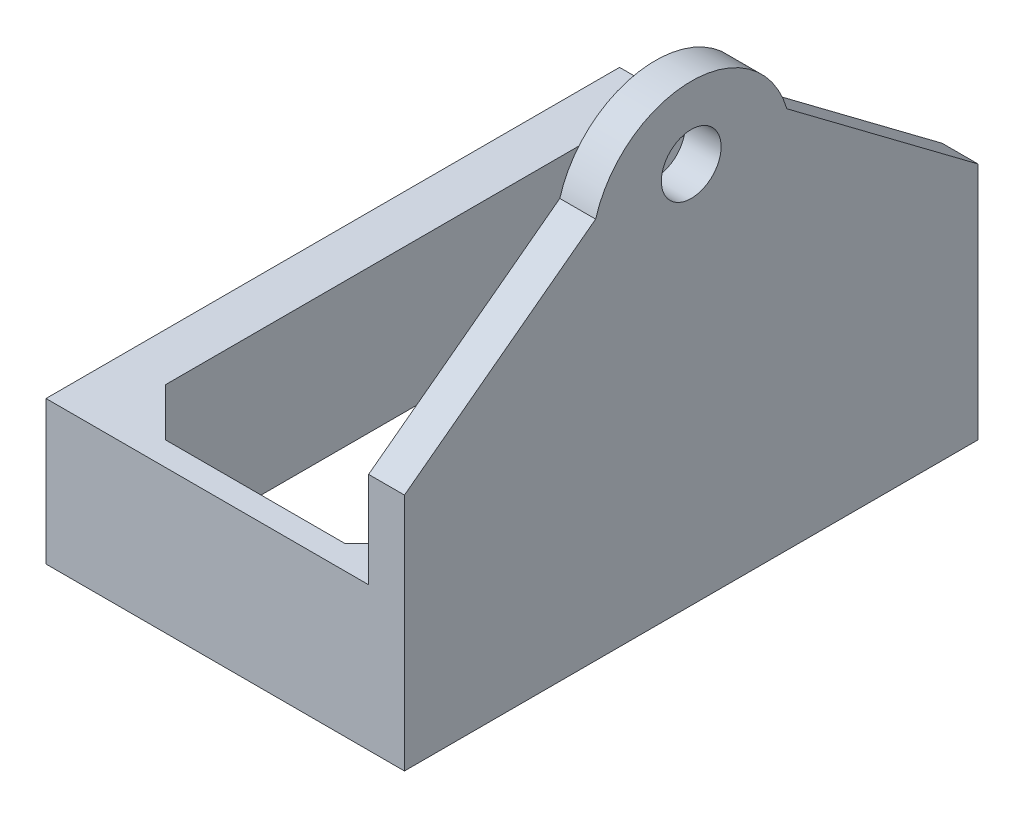
ISO-10303-21;
HEADER;
FILE_DESCRIPTION(('STEP AP214'),'2;1');
FILE_NAME('part.step','',(''),(''),'','','');
FILE_SCHEMA(('AUTOMOTIVE_DESIGN { 1 0 10303 214 1 1 1 1 }'));
ENDSEC;
DATA;
#1=APPLICATION_CONTEXT('core data for automotive mechanical design processes');
#2=APPLICATION_PROTOCOL_DEFINITION('international standard','automotive_design',2000,#1);
#3=PRODUCT_CONTEXT('',#1,'mechanical');
#4=PRODUCT('Part','Part','',(#3));
#5=PRODUCT_RELATED_PRODUCT_CATEGORY('part','',(#4));
#6=PRODUCT_DEFINITION_FORMATION('','',#4);
#7=PRODUCT_DEFINITION_CONTEXT('part definition',#1,'design');
#8=PRODUCT_DEFINITION('design','',#6,#7);
#9=PRODUCT_DEFINITION_SHAPE('','',#8);
#10=(LENGTH_UNIT() NAMED_UNIT(*) SI_UNIT(.MILLI.,.METRE.));
#11=(NAMED_UNIT(*) PLANE_ANGLE_UNIT() SI_UNIT($,.RADIAN.));
#12=(NAMED_UNIT(*) SI_UNIT($,.STERADIAN.) SOLID_ANGLE_UNIT());
#13=UNCERTAINTY_MEASURE_WITH_UNIT(LENGTH_MEASURE(1.E-05),#10,'distance_accuracy_value','');
#14=(GEOMETRIC_REPRESENTATION_CONTEXT(3) GLOBAL_UNCERTAINTY_ASSIGNED_CONTEXT((#13)) GLOBAL_UNIT_ASSIGNED_CONTEXT((#10,
#11,#12)) REPRESENTATION_CONTEXT('',''));
#15=CARTESIAN_POINT('',(0.,0.,0.));
#16=DIRECTION('',(0.,0.,1.));
#17=DIRECTION('',(1.,0.,0.));
#18=AXIS2_PLACEMENT_3D('',#15,#16,#17);
#19=CARTESIAN_POINT('',(-17.4625,6.35,0.));
#20=DIRECTION('',(1.,0.,0.));
#21=DIRECTION('',(0.,0.,-1.));
#22=AXIS2_PLACEMENT_3D('',#19,#20,#21);
#23=PLANE('',#22);
#24=DIRECTION('',(0.,0.,-1.));
#25=VECTOR('',#24,1.);
#26=CARTESIAN_POINT('',(-17.4625,19.05,-38.1));
#27=LINE('',#26,#25);
#28=CARTESIAN_POINT('',(-17.4625,19.05,28.575));
#29=VERTEX_POINT('',#28);
#30=CARTESIAN_POINT('',(-17.4625,19.05,-28.575));
#31=VERTEX_POINT('',#30);
#32=EDGE_CURVE('E162',#29,#31,#27,.T.);
#33=ORIENTED_EDGE('',*,*,#32,.F.);
#34=DIRECTION('',(0.,-1.,0.));
#35=VECTOR('',#34,1.);
#36=CARTESIAN_POINT('',(-17.4625,6.35,28.575));
#37=LINE('',#36,#35);
#38=CARTESIAN_POINT('',(-17.4625,0.,28.575));
#39=VERTEX_POINT('',#38);
#40=EDGE_CURVE('E224',#29,#39,#37,.T.);
#41=ORIENTED_EDGE('',*,*,#40,.T.);
#42=DIRECTION('',(0.,0.,1.));
#43=VECTOR('',#42,1.);
#44=CARTESIAN_POINT('',(-17.4625,0.,0.));
#45=LINE('',#44,#43);
#46=CARTESIAN_POINT('',(-17.4625,0.,-28.575));
#47=VERTEX_POINT('',#46);
#48=EDGE_CURVE('E183',#47,#39,#45,.T.);
#49=ORIENTED_EDGE('',*,*,#48,.F.);
#50=DIRECTION('',(0.,1.,0.));
#51=VECTOR('',#50,1.);
#52=CARTESIAN_POINT('',(-17.4625,19.05,-28.575));
#53=LINE('',#52,#51);
#54=EDGE_CURVE('E222',#47,#31,#53,.T.);
#55=ORIENTED_EDGE('',*,*,#54,.T.);
#56=EDGE_LOOP('',(#33,#41,#49,#55));
#57=FACE_BOUND('',#56,.T.);
#58=ADVANCED_FACE('F37',(#57),#23,.T.);
#59=CARTESIAN_POINT('',(19.05,60.325,0.));
#60=DIRECTION('',(1.,0.,0.));
#61=DIRECTION('',(0.,0.,-1.));
#62=AXIS2_PLACEMENT_3D('',#59,#60,#61);
#63=PLANE('',#62);
#64=CARTESIAN_POINT('',(19.05,50.8,0.));
#65=DIRECTION('',(1.,0.,0.));
#66=DIRECTION('',(0.,0.,-1.));
#67=AXIS2_PLACEMENT_3D('',#64,#65,#66);
#68=CIRCLE('',#67,3.96875);
#69=CARTESIAN_POINT('',(19.05,50.8,-3.96875));
#70=VERTEX_POINT('',#69);
#71=EDGE_CURVE('E312',#70,#70,#68,.F.);
#72=ORIENTED_EDGE('',*,*,#71,.F.);
#73=EDGE_LOOP('',(#72));
#74=FACE_BOUND('',#73,.T.);
#75=DIRECTION('',(0.,0.,-1.));
#76=VECTOR('',#75,1.);
#77=CARTESIAN_POINT('',(19.05,19.05,-38.1));
#78=LINE('',#77,#76);
#79=CARTESIAN_POINT('',(19.05,19.05,-28.5749999999999));
#80=VERTEX_POINT('',#79);
#81=CARTESIAN_POINT('',(19.05,19.05,-38.1));
#82=VERTEX_POINT('',#81);
#83=EDGE_CURVE('E165',#80,#82,#78,.T.);
#84=ORIENTED_EDGE('',*,*,#83,.F.);
#85=DIRECTION('',(0.,-1.,0.));
#86=VECTOR('',#85,1.);
#87=CARTESIAN_POINT('',(19.05,60.325,-28.5749999999999));
#88=LINE('',#87,#86);
#89=CARTESIAN_POINT('',(19.05,0.,-28.5749999999999));
#90=VERTEX_POINT('',#89);
#91=EDGE_CURVE('E210',#80,#90,#88,.T.);
#92=ORIENTED_EDGE('',*,*,#91,.T.);
#93=DIRECTION('',(0.,0.,1.));
#94=VECTOR('',#93,1.);
#95=CARTESIAN_POINT('',(19.05,0.,0.));
#96=LINE('',#95,#94);
#97=CARTESIAN_POINT('',(19.05,0.,28.575));
#98=VERTEX_POINT('',#97);
#99=EDGE_CURVE('E280',#90,#98,#96,.T.);
#100=ORIENTED_EDGE('',*,*,#99,.T.);
#101=DIRECTION('',(0.,1.,0.));
#102=VECTOR('',#101,1.);
#103=CARTESIAN_POINT('',(19.05,19.05,28.575));
#104=LINE('',#103,#102);
#105=CARTESIAN_POINT('',(19.05,19.05,28.575));
#106=VERTEX_POINT('',#105);
#107=EDGE_CURVE('E207',#98,#106,#104,.T.);
#108=ORIENTED_EDGE('',*,*,#107,.T.);
#109=DIRECTION('',(0.,0.,-1.));
#110=VECTOR('',#109,1.);
#111=CARTESIAN_POINT('',(19.05,19.05,38.1));
#112=LINE('',#111,#110);
#113=CARTESIAN_POINT('',(19.05,19.05,38.1));
#114=VERTEX_POINT('',#113);
#115=EDGE_CURVE('E173',#114,#106,#112,.T.);
#116=ORIENTED_EDGE('',*,*,#115,.F.);
#117=DIRECTION('',(0.,-1.,0.));
#118=VECTOR('',#117,1.);
#119=CARTESIAN_POINT('',(19.05,60.325,38.1));
#120=LINE('',#119,#118);
#121=CARTESIAN_POINT('',(19.05,31.75,38.1));
#122=VERTEX_POINT('',#121);
#123=EDGE_CURVE('E181',#122,#114,#120,.T.);
#124=ORIENTED_EDGE('',*,*,#123,.F.);
#125=DIRECTION('',(0.,-0.6,0.8));
#126=VECTOR('',#125,1.);
#127=CARTESIAN_POINT('',(19.05,38.608,28.956));
#128=LINE('',#127,#126);
#129=CARTESIAN_POINT('',(19.05,50.8,12.7));
#130=VERTEX_POINT('',#129);
#131=EDGE_CURVE('E304',#130,#122,#128,.T.);
#132=ORIENTED_EDGE('',*,*,#131,.F.);
#133=CARTESIAN_POINT('',(19.05,47.0958333333333,0.));
#134=DIRECTION('',(1.,0.,0.));
#135=DIRECTION('',(0.,0.,-1.));
#136=AXIS2_PLACEMENT_3D('',#133,#134,#135);
#137=CIRCLE('',#136,13.2291666666667);
#138=CARTESIAN_POINT('',(19.05,50.8,-12.7));
#139=VERTEX_POINT('',#138);
#140=EDGE_CURVE('E292',#139,#130,#137,.T.);
#141=ORIENTED_EDGE('',*,*,#140,.F.);
#142=DIRECTION('',(0.,0.6,0.8));
#143=VECTOR('',#142,1.);
#144=CARTESIAN_POINT('',(19.05,38.608,-28.956));
#145=LINE('',#144,#143);
#146=CARTESIAN_POINT('',(19.05,31.75,-38.1));
#147=VERTEX_POINT('',#146);
#148=EDGE_CURVE('E179',#147,#139,#145,.T.);
#149=ORIENTED_EDGE('',*,*,#148,.F.);
#150=DIRECTION('',(0.,-1.,0.));
#151=VECTOR('',#150,1.);
#152=CARTESIAN_POINT('',(19.05,60.325,-38.1));
#153=LINE('',#152,#151);
#154=EDGE_CURVE('E155',#147,#82,#153,.T.);
#155=ORIENTED_EDGE('',*,*,#154,.T.);
#156=EDGE_LOOP('',(#84,#92,#100,#108,#116,#124,#132,#141,#149,#155));
#157=FACE_BOUND('',#156,.T.);
#158=ADVANCED_FACE('F177',(#74,#157),#63,.F.);
#159=CARTESIAN_POINT('',(0.,6.35,-34.925));
#160=DIRECTION('',(0.,0.,1.));
#161=DIRECTION('',(1.,0.,0.));
#162=AXIS2_PLACEMENT_3D('',#159,#160,#161);
#163=PLANE('',#162);
#164=DIRECTION('',(-1.,0.,0.));
#165=VECTOR('',#164,1.);
#166=CARTESIAN_POINT('',(0.,0.,-34.925));
#167=LINE('',#166,#165);
#168=CARTESIAN_POINT('',(12.7,0.,-34.925));
#169=VERTEX_POINT('',#168);
#170=CARTESIAN_POINT('',(-11.1124999999999,0.,-34.925));
#171=VERTEX_POINT('',#170);
#172=EDGE_CURVE('E191',#169,#171,#167,.T.);
#173=ORIENTED_EDGE('',*,*,#172,.F.);
#174=DIRECTION('',(0.,1.,0.));
#175=VECTOR('',#174,1.);
#176=CARTESIAN_POINT('',(12.7,6.35,-34.925));
#177=LINE('',#176,#175);
#178=CARTESIAN_POINT('',(12.7,19.05,-34.925));
#179=VERTEX_POINT('',#178);
#180=EDGE_CURVE('E215',#169,#179,#177,.T.);
#181=ORIENTED_EDGE('',*,*,#180,.T.);
#182=DIRECTION('',(1.,0.,0.));
#183=VECTOR('',#182,1.);
#184=CARTESIAN_POINT('',(-17.4625,19.05,-34.925));
#185=LINE('',#184,#183);
#186=CARTESIAN_POINT('',(-11.1124999999999,19.05,-34.925));
#187=VERTEX_POINT('',#186);
#188=EDGE_CURVE('E174',#187,#179,#185,.T.);
#189=ORIENTED_EDGE('',*,*,#188,.F.);
#190=DIRECTION('',(0.,-1.,0.));
#191=VECTOR('',#190,1.);
#192=CARTESIAN_POINT('',(-11.1124999999999,0.,-34.925));
#193=LINE('',#192,#191);
#194=EDGE_CURVE('E212',#187,#171,#193,.T.);
#195=ORIENTED_EDGE('',*,*,#194,.T.);
#196=EDGE_LOOP('',(#173,#181,#189,#195));
#197=FACE_BOUND('',#196,.T.);
#198=ADVANCED_FACE('F262',(#197),#163,.T.);
#199=CARTESIAN_POINT('',(0.,6.35,-38.1));
#200=DIRECTION('',(0.,0.,1.));
#201=DIRECTION('',(1.,0.,0.));
#202=AXIS2_PLACEMENT_3D('',#199,#200,#201);
#203=PLANE('',#202);
#204=ORIENTED_EDGE('',*,*,#154,.F.);
#205=DIRECTION('',(1.,0.,0.));
#206=VECTOR('',#205,1.);
#207=CARTESIAN_POINT('',(-23.8135,31.75,-38.1));
#208=LINE('',#207,#206);
#209=CARTESIAN_POINT('',(23.8125,31.75,-38.1));
#210=VERTEX_POINT('',#209);
#211=EDGE_CURVE('E310',#147,#210,#208,.T.);
#212=ORIENTED_EDGE('',*,*,#211,.T.);
#213=DIRECTION('',(0.,-1.,0.));
#214=VECTOR('',#213,1.);
#215=CARTESIAN_POINT('',(23.8125,60.325,-38.1));
#216=LINE('',#215,#214);
#217=CARTESIAN_POINT('',(23.8125,0.,-38.1));
#218=VERTEX_POINT('',#217);
#219=EDGE_CURVE('E180',#210,#218,#216,.T.);
#220=ORIENTED_EDGE('',*,*,#219,.T.);
#221=DIRECTION('',(-1.,0.,0.));
#222=VECTOR('',#221,1.);
#223=CARTESIAN_POINT('',(0.,0.,-38.1));
#224=LINE('',#223,#222);
#225=CARTESIAN_POINT('',(-23.8125,0.,-38.1));
#226=VERTEX_POINT('',#225);
#227=EDGE_CURVE('E193',#218,#226,#224,.T.);
#228=ORIENTED_EDGE('',*,*,#227,.T.);
#229=DIRECTION('',(0.,-1.,0.));
#230=VECTOR('',#229,1.);
#231=CARTESIAN_POINT('',(-23.8125,6.35,-38.1));
#232=LINE('',#231,#230);
#233=CARTESIAN_POINT('',(-23.8125,19.05,-38.1));
#234=VERTEX_POINT('',#233);
#235=EDGE_CURVE('E157',#234,#226,#232,.T.);
#236=ORIENTED_EDGE('',*,*,#235,.F.);
#237=DIRECTION('',(-1.,0.,0.));
#238=VECTOR('',#237,1.);
#239=CARTESIAN_POINT('',(-23.8125,19.05,-38.1));
#240=LINE('',#239,#238);
#241=EDGE_CURVE('E150',#82,#234,#240,.T.);
#242=ORIENTED_EDGE('',*,*,#241,.F.);
#243=EDGE_LOOP('',(#204,#212,#220,#228,#236,#242));
#244=FACE_BOUND('',#243,.T.);
#245=ADVANCED_FACE('F152',(#244),#203,.F.);
#246=CARTESIAN_POINT('',(-23.8125,6.35,0.));
#247=DIRECTION('',(-1.,0.,0.));
#248=DIRECTION('',(0.,0.,1.));
#249=AXIS2_PLACEMENT_3D('',#246,#247,#248);
#250=PLANE('',#249);
#251=DIRECTION('',(0.,0.,-1.));
#252=VECTOR('',#251,1.);
#253=CARTESIAN_POINT('',(-23.8125,0.,0.));
#254=LINE('',#253,#252);
#255=CARTESIAN_POINT('',(-23.8125,0.,38.1));
#256=VERTEX_POINT('',#255);
#257=EDGE_CURVE('E195',#256,#226,#254,.T.);
#258=ORIENTED_EDGE('',*,*,#257,.F.);
#259=DIRECTION('',(0.,-1.,0.));
#260=VECTOR('',#259,1.);
#261=CARTESIAN_POINT('',(-23.8125,6.35,38.1));
#262=LINE('',#261,#260);
#263=CARTESIAN_POINT('',(-23.8125,19.05,38.1));
#264=VERTEX_POINT('',#263);
#265=EDGE_CURVE('E204',#264,#256,#262,.T.);
#266=ORIENTED_EDGE('',*,*,#265,.F.);
#267=DIRECTION('',(0.,0.,1.));
#268=VECTOR('',#267,1.);
#269=CARTESIAN_POINT('',(-23.8125,19.05,-38.1));
#270=LINE('',#269,#268);
#271=EDGE_CURVE('E290',#234,#264,#270,.T.);
#272=ORIENTED_EDGE('',*,*,#271,.F.);
#273=ORIENTED_EDGE('',*,*,#235,.T.);
#274=EDGE_LOOP('',(#258,#266,#272,#273));
#275=FACE_BOUND('',#274,.T.);
#276=ADVANCED_FACE('F329',(#275),#250,.T.);
#277=CARTESIAN_POINT('',(0.,6.35,38.1));
#278=DIRECTION('',(0.,0.,1.));
#279=DIRECTION('',(1.,0.,0.));
#280=AXIS2_PLACEMENT_3D('',#277,#278,#279);
#281=PLANE('',#280);
#282=ORIENTED_EDGE('',*,*,#123,.T.);
#283=DIRECTION('',(1.,0.,0.));
#284=VECTOR('',#283,1.);
#285=CARTESIAN_POINT('',(-23.8125,19.05,38.1));
#286=LINE('',#285,#284);
#287=EDGE_CURVE('E244',#264,#114,#286,.T.);
#288=ORIENTED_EDGE('',*,*,#287,.F.);
#289=ORIENTED_EDGE('',*,*,#265,.T.);
#290=DIRECTION('',(-1.,0.,0.));
#291=VECTOR('',#290,1.);
#292=CARTESIAN_POINT('',(0.,0.,38.1));
#293=LINE('',#292,#291);
#294=CARTESIAN_POINT('',(23.8125,0.,38.1));
#295=VERTEX_POINT('',#294);
#296=EDGE_CURVE('E198',#295,#256,#293,.T.);
#297=ORIENTED_EDGE('',*,*,#296,.F.);
#298=DIRECTION('',(0.,-1.,0.));
#299=VECTOR('',#298,1.);
#300=CARTESIAN_POINT('',(23.8125,60.325,38.1));
#301=LINE('',#300,#299);
#302=CARTESIAN_POINT('',(23.8125,31.75,38.1));
#303=VERTEX_POINT('',#302);
#304=EDGE_CURVE('E186',#303,#295,#301,.T.);
#305=ORIENTED_EDGE('',*,*,#304,.F.);
#306=DIRECTION('',(1.,0.,0.));
#307=VECTOR('',#306,1.);
#308=CARTESIAN_POINT('',(-23.8135,31.75,38.1));
#309=LINE('',#308,#307);
#310=EDGE_CURVE('E295',#122,#303,#309,.T.);
#311=ORIENTED_EDGE('',*,*,#310,.F.);
#312=EDGE_LOOP('',(#282,#288,#289,#297,#305,#311));
#313=FACE_BOUND('',#312,.T.);
#314=ADVANCED_FACE('F333',(#313),#281,.T.);
#315=CARTESIAN_POINT('',(0.,6.35,34.925));
#316=DIRECTION('',(0.,0.,1.));
#317=DIRECTION('',(1.,0.,0.));
#318=AXIS2_PLACEMENT_3D('',#315,#316,#317);
#319=PLANE('',#318);
#320=DIRECTION('',(-1.,0.,0.));
#321=VECTOR('',#320,1.);
#322=CARTESIAN_POINT('',(-17.4625,19.05,34.925));
#323=LINE('',#322,#321);
#324=CARTESIAN_POINT('',(12.7,19.05,34.925));
#325=VERTEX_POINT('',#324);
#326=CARTESIAN_POINT('',(-11.1125,19.05,34.925));
#327=VERTEX_POINT('',#326);
#328=EDGE_CURVE('E241',#325,#327,#323,.T.);
#329=ORIENTED_EDGE('',*,*,#328,.F.);
#330=DIRECTION('',(0.,-1.,0.));
#331=VECTOR('',#330,1.);
#332=CARTESIAN_POINT('',(12.7,0.,34.925));
#333=LINE('',#332,#331);
#334=CARTESIAN_POINT('',(12.7,0.,34.925));
#335=VERTEX_POINT('',#334);
#336=EDGE_CURVE('E219',#325,#335,#333,.T.);
#337=ORIENTED_EDGE('',*,*,#336,.T.);
#338=DIRECTION('',(-1.,0.,0.));
#339=VECTOR('',#338,1.);
#340=CARTESIAN_POINT('',(0.,0.,34.925));
#341=LINE('',#340,#339);
#342=CARTESIAN_POINT('',(-11.1125,0.,34.925));
#343=VERTEX_POINT('',#342);
#344=EDGE_CURVE('E201',#335,#343,#341,.T.);
#345=ORIENTED_EDGE('',*,*,#344,.T.);
#346=DIRECTION('',(0.,1.,0.));
#347=VECTOR('',#346,1.);
#348=CARTESIAN_POINT('',(-11.1125,6.35,34.925));
#349=LINE('',#348,#347);
#350=EDGE_CURVE('E217',#343,#327,#349,.T.);
#351=ORIENTED_EDGE('',*,*,#350,.T.);
#352=EDGE_LOOP('',(#329,#337,#345,#351));
#353=FACE_BOUND('',#352,.T.);
#354=ADVANCED_FACE('F339',(#353),#319,.F.);
#355=CARTESIAN_POINT('',(0.,0.,0.));
#356=DIRECTION('',(0.,1.,0.));
#357=DIRECTION('',(0.,0.,1.));
#358=AXIS2_PLACEMENT_3D('',#355,#356,#357);
#359=PLANE('',#358);
#360=DIRECTION('',(0.,0.,-1.));
#361=VECTOR('',#360,1.);
#362=CARTESIAN_POINT('',(23.8125,0.,0.));
#363=LINE('',#362,#361);
#364=EDGE_CURVE('E161',#295,#218,#363,.T.);
#365=ORIENTED_EDGE('',*,*,#364,.F.);
#366=ORIENTED_EDGE('',*,*,#296,.T.);
#367=ORIENTED_EDGE('',*,*,#257,.T.);
#368=ORIENTED_EDGE('',*,*,#227,.F.);
#369=EDGE_LOOP('',(#365,#366,#367,#368));
#370=FACE_BOUND('',#369,.T.);
#371=ORIENTED_EDGE('',*,*,#172,.T.);
#372=DIRECTION('',(0.707106781186551,0.,-0.707106781186544));
#373=VECTOR('',#372,1.);
#374=CARTESIAN_POINT('',(-23.0187499999999,0.,-23.0187500000002));
#375=LINE('',#374,#373);
#376=EDGE_CURVE('E45',#171,#47,#375,.F.);
#377=ORIENTED_EDGE('',*,*,#376,.T.);
#378=ORIENTED_EDGE('',*,*,#48,.T.);
#379=DIRECTION('',(0.707106781186544,0.,0.707106781186551));
#380=VECTOR('',#379,1.);
#381=CARTESIAN_POINT('',(-23.0187500000001,0.,23.0187499999999));
#382=LINE('',#381,#380);
#383=EDGE_CURVE('E52',#39,#343,#382,.T.);
#384=ORIENTED_EDGE('',*,*,#383,.T.);
#385=ORIENTED_EDGE('',*,*,#344,.F.);
#386=DIRECTION('',(-0.707106781186551,0.,0.707106781186545));
#387=VECTOR('',#386,1.);
#388=CARTESIAN_POINT('',(23.8124999999999,0.,23.8125000000001));
#389=LINE('',#388,#387);
#390=EDGE_CURVE('E229',#335,#98,#389,.F.);
#391=ORIENTED_EDGE('',*,*,#390,.T.);
#392=ORIENTED_EDGE('',*,*,#99,.F.);
#393=DIRECTION('',(-0.707106781186544,0.,-0.707106781186551));
#394=VECTOR('',#393,1.);
#395=CARTESIAN_POINT('',(23.8125000000001,0.,-23.8124999999998));
#396=LINE('',#395,#394);
#397=EDGE_CURVE('E226',#90,#169,#396,.T.);
#398=ORIENTED_EDGE('',*,*,#397,.T.);
#399=EDGE_LOOP('',(#371,#377,#378,#384,#385,#391,#392,#398));
#400=FACE_BOUND('',#399,.T.);
#401=ADVANCED_FACE('F282',(#370,#400),#359,.F.);
#402=CARTESIAN_POINT('',(23.8125,60.325,0.));
#403=DIRECTION('',(-1.,0.,0.));
#404=DIRECTION('',(0.,0.,1.));
#405=AXIS2_PLACEMENT_3D('',#402,#403,#404);
#406=PLANE('',#405);
#407=CARTESIAN_POINT('',(23.8125,50.8,0.));
#408=DIRECTION('',(1.,0.,0.));
#409=DIRECTION('',(0.,0.,-1.));
#410=AXIS2_PLACEMENT_3D('',#407,#408,#409);
#411=CIRCLE('',#410,3.96875);
#412=CARTESIAN_POINT('',(23.8125,50.8,-3.96875));
#413=VERTEX_POINT('',#412);
#414=EDGE_CURVE('E317',#413,#413,#411,.T.);
#415=ORIENTED_EDGE('',*,*,#414,.F.);
#416=EDGE_LOOP('',(#415));
#417=FACE_BOUND('',#416,.T.);
#418=ORIENTED_EDGE('',*,*,#219,.F.);
#419=DIRECTION('',(0.,-0.6,-0.8));
#420=VECTOR('',#419,1.);
#421=CARTESIAN_POINT('',(23.8125,38.608,-28.956));
#422=LINE('',#421,#420);
#423=CARTESIAN_POINT('',(23.8125,50.8,-12.7));
#424=VERTEX_POINT('',#423);
#425=EDGE_CURVE('E307',#424,#210,#422,.T.);
#426=ORIENTED_EDGE('',*,*,#425,.F.);
#427=CARTESIAN_POINT('',(23.8125,47.0958333333333,0.));
#428=DIRECTION('',(1.,0.,0.));
#429=DIRECTION('',(0.,0.,-1.));
#430=AXIS2_PLACEMENT_3D('',#427,#428,#429);
#431=CIRCLE('',#430,13.2291666666667);
#432=CARTESIAN_POINT('',(23.8125,50.8,12.7));
#433=VERTEX_POINT('',#432);
#434=EDGE_CURVE('E298',#433,#424,#431,.F.);
#435=ORIENTED_EDGE('',*,*,#434,.F.);
#436=DIRECTION('',(0.,0.6,-0.8));
#437=VECTOR('',#436,1.);
#438=CARTESIAN_POINT('',(23.8125,38.608,28.956));
#439=LINE('',#438,#437);
#440=EDGE_CURVE('E301',#303,#433,#439,.T.);
#441=ORIENTED_EDGE('',*,*,#440,.F.);
#442=ORIENTED_EDGE('',*,*,#304,.T.);
#443=ORIENTED_EDGE('',*,*,#364,.T.);
#444=EDGE_LOOP('',(#418,#426,#435,#441,#442,#443));
#445=FACE_BOUND('',#444,.T.);
#446=ADVANCED_FACE('F346',(#417,#445),#406,.F.);
#447=CARTESIAN_POINT('',(0.,19.05,0.));
#448=DIRECTION('',(0.,1.,0.));
#449=DIRECTION('',(0.,0.,1.));
#450=AXIS2_PLACEMENT_3D('',#447,#448,#449);
#451=PLANE('',#450);
#452=ORIENTED_EDGE('',*,*,#271,.T.);
#453=ORIENTED_EDGE('',*,*,#287,.T.);
#454=ORIENTED_EDGE('',*,*,#115,.T.);
#455=DIRECTION('',(0.707106781186551,0.,-0.707106781186545));
#456=VECTOR('',#455,1.);
#457=CARTESIAN_POINT('',(12.7,19.05,34.925));
#458=LINE('',#457,#456);
#459=EDGE_CURVE('E231',#106,#325,#458,.F.);
#460=ORIENTED_EDGE('',*,*,#459,.T.);
#461=ORIENTED_EDGE('',*,*,#328,.T.);
#462=DIRECTION('',(-0.707106781186544,0.,-0.707106781186551));
#463=VECTOR('',#462,1.);
#464=CARTESIAN_POINT('',(-17.4625,19.05,28.575));
#465=LINE('',#464,#463);
#466=EDGE_CURVE('E234',#327,#29,#465,.T.);
#467=ORIENTED_EDGE('',*,*,#466,.T.);
#468=ORIENTED_EDGE('',*,*,#32,.T.);
#469=DIRECTION('',(-0.707106781186551,0.,0.707106781186544));
#470=VECTOR('',#469,1.);
#471=CARTESIAN_POINT('',(-11.1124999999999,19.05,-34.925));
#472=LINE('',#471,#470);
#473=EDGE_CURVE('E12',#31,#187,#472,.F.);
#474=ORIENTED_EDGE('',*,*,#473,.T.);
#475=ORIENTED_EDGE('',*,*,#188,.T.);
#476=DIRECTION('',(0.707106781186544,0.,0.707106781186551));
#477=VECTOR('',#476,1.);
#478=CARTESIAN_POINT('',(19.05,19.05,-28.5749999999999));
#479=LINE('',#478,#477);
#480=EDGE_CURVE('E169',#179,#80,#479,.T.);
#481=ORIENTED_EDGE('',*,*,#480,.T.);
#482=ORIENTED_EDGE('',*,*,#83,.T.);
#483=ORIENTED_EDGE('',*,*,#241,.T.);
#484=EDGE_LOOP('',(#452,#453,#454,#460,#461,#467,#468,#474,#475,#481,#482,#483));
#485=FACE_BOUND('',#484,.T.);
#486=ADVANCED_FACE('F166',(#485),#451,.T.);
#487=CARTESIAN_POINT('',(-23.8135,38.608,28.956));
#488=DIRECTION('',(0.,-0.8,-0.6));
#489=DIRECTION('',(0.,0.6,-0.8));
#490=AXIS2_PLACEMENT_3D('',#487,#488,#489);
#491=PLANE('',#490);
#492=ORIENTED_EDGE('',*,*,#131,.T.);
#493=ORIENTED_EDGE('',*,*,#310,.T.);
#494=ORIENTED_EDGE('',*,*,#440,.T.);
#495=DIRECTION('',(1.,0.,0.));
#496=VECTOR('',#495,1.);
#497=CARTESIAN_POINT('',(-23.8135,50.8,12.7));
#498=LINE('',#497,#496);
#499=EDGE_CURVE('E296',#130,#433,#498,.T.);
#500=ORIENTED_EDGE('',*,*,#499,.F.);
#501=EDGE_LOOP('',(#492,#493,#494,#500));
#502=FACE_BOUND('',#501,.T.);
#503=ADVANCED_FACE('F353',(#502),#491,.F.);
#504=CARTESIAN_POINT('',(-23.8135,47.0958333333333,0.));
#505=DIRECTION('',(1.,0.,0.));
#506=DIRECTION('',(0.,0.,-1.));
#507=AXIS2_PLACEMENT_3D('',#504,#505,#506);
#508=CYLINDRICAL_SURFACE('',#507,13.2291666666667);
#509=ORIENTED_EDGE('',*,*,#140,.T.);
#510=ORIENTED_EDGE('',*,*,#499,.T.);
#511=ORIENTED_EDGE('',*,*,#434,.T.);
#512=DIRECTION('',(1.,0.,0.));
#513=VECTOR('',#512,1.);
#514=CARTESIAN_POINT('',(-23.8135,50.8,-12.7));
#515=LINE('',#514,#513);
#516=EDGE_CURVE('E309',#139,#424,#515,.T.);
#517=ORIENTED_EDGE('',*,*,#516,.F.);
#518=EDGE_LOOP('',(#509,#510,#511,#517));
#519=FACE_BOUND('',#518,.T.);
#520=ADVANCED_FACE('F356',(#519),#508,.T.);
#521=CARTESIAN_POINT('',(-23.8135,38.608,-28.956));
#522=DIRECTION('',(0.,-0.8,0.6));
#523=DIRECTION('',(0.,-0.6,-0.8));
#524=AXIS2_PLACEMENT_3D('',#521,#522,#523);
#525=PLANE('',#524);
#526=ORIENTED_EDGE('',*,*,#148,.T.);
#527=ORIENTED_EDGE('',*,*,#516,.T.);
#528=ORIENTED_EDGE('',*,*,#425,.T.);
#529=ORIENTED_EDGE('',*,*,#211,.F.);
#530=EDGE_LOOP('',(#526,#527,#528,#529));
#531=FACE_BOUND('',#530,.T.);
#532=ADVANCED_FACE('F274',(#531),#525,.F.);
#533=CARTESIAN_POINT('',(-23.8135,50.8,0.));
#534=DIRECTION('',(1.,0.,0.));
#535=DIRECTION('',(0.,0.,-1.));
#536=AXIS2_PLACEMENT_3D('',#533,#534,#535);
#537=CYLINDRICAL_SURFACE('',#536,3.96875);
#538=ORIENTED_EDGE('',*,*,#414,.T.);
#539=EDGE_LOOP('',(#538));
#540=FACE_BOUND('',#539,.T.);
#541=ORIENTED_EDGE('',*,*,#71,.T.);
#542=EDGE_LOOP('',(#541));
#543=FACE_BOUND('',#542,.T.);
#544=ADVANCED_FACE('F269',(#540,#543),#537,.F.);
#545=CARTESIAN_POINT('',(19.05,60.325,-28.5749999999999));
#546=DIRECTION('',(0.707106781186551,0.,-0.707106781186544));
#547=DIRECTION('',(0.,-1.,0.));
#548=AXIS2_PLACEMENT_3D('',#545,#546,#547);
#549=PLANE('',#548);
#550=ORIENTED_EDGE('',*,*,#480,.F.);
#551=ORIENTED_EDGE('',*,*,#180,.F.);
#552=ORIENTED_EDGE('',*,*,#397,.F.);
#553=ORIENTED_EDGE('',*,*,#91,.F.);
#554=EDGE_LOOP('',(#550,#551,#552,#553));
#555=FACE_BOUND('',#554,.T.);
#556=ADVANCED_FACE('F254',(#555),#549,.F.);
#557=CARTESIAN_POINT('',(12.7,6.35,34.925));
#558=DIRECTION('',(-0.707106781186544,0.,-0.70710678118655));
#559=DIRECTION('',(0.,1.,0.));
#560=AXIS2_PLACEMENT_3D('',#557,#558,#559);
#561=PLANE('',#560);
#562=ORIENTED_EDGE('',*,*,#459,.F.);
#563=ORIENTED_EDGE('',*,*,#107,.F.);
#564=ORIENTED_EDGE('',*,*,#390,.F.);
#565=ORIENTED_EDGE('',*,*,#336,.F.);
#566=EDGE_LOOP('',(#562,#563,#564,#565));
#567=FACE_BOUND('',#566,.T.);
#568=ADVANCED_FACE('F248',(#567),#561,.T.);
#569=CARTESIAN_POINT('',(-17.4625,6.35,28.575));
#570=DIRECTION('',(-0.707106781186551,0.,0.707106781186544));
#571=DIRECTION('',(0.,-1.,0.));
#572=AXIS2_PLACEMENT_3D('',#569,#570,#571);
#573=PLANE('',#572);
#574=ORIENTED_EDGE('',*,*,#466,.F.);
#575=ORIENTED_EDGE('',*,*,#350,.F.);
#576=ORIENTED_EDGE('',*,*,#383,.F.);
#577=ORIENTED_EDGE('',*,*,#40,.F.);
#578=EDGE_LOOP('',(#574,#575,#576,#577));
#579=FACE_BOUND('',#578,.T.);
#580=ADVANCED_FACE('F246',(#579),#573,.F.);
#581=CARTESIAN_POINT('',(-11.1124999999999,6.35,-34.925));
#582=DIRECTION('',(0.707106781186544,0.,0.707106781186551));
#583=DIRECTION('',(0.,1.,0.));
#584=AXIS2_PLACEMENT_3D('',#581,#582,#583);
#585=PLANE('',#584);
#586=ORIENTED_EDGE('',*,*,#473,.F.);
#587=ORIENTED_EDGE('',*,*,#54,.F.);
#588=ORIENTED_EDGE('',*,*,#376,.F.);
#589=ORIENTED_EDGE('',*,*,#194,.F.);
#590=EDGE_LOOP('',(#586,#587,#588,#589));
#591=FACE_BOUND('',#590,.T.);
#592=ADVANCED_FACE('F39',(#591),#585,.T.);
#593=CLOSED_SHELL('',(#58,#158,#198,#245,#276,#314,#354,#401,#446,#486,#503,#520,#532,#544,#556,
#568,#580,#592));
#594=MANIFOLD_SOLID_BREP('B2',#593);
#595=ADVANCED_BREP_SHAPE_REPRESENTATION('',(#18,#594),#14);
#596=SHAPE_DEFINITION_REPRESENTATION(#9,#595);
ENDSEC;
END-ISO-10303-21;
